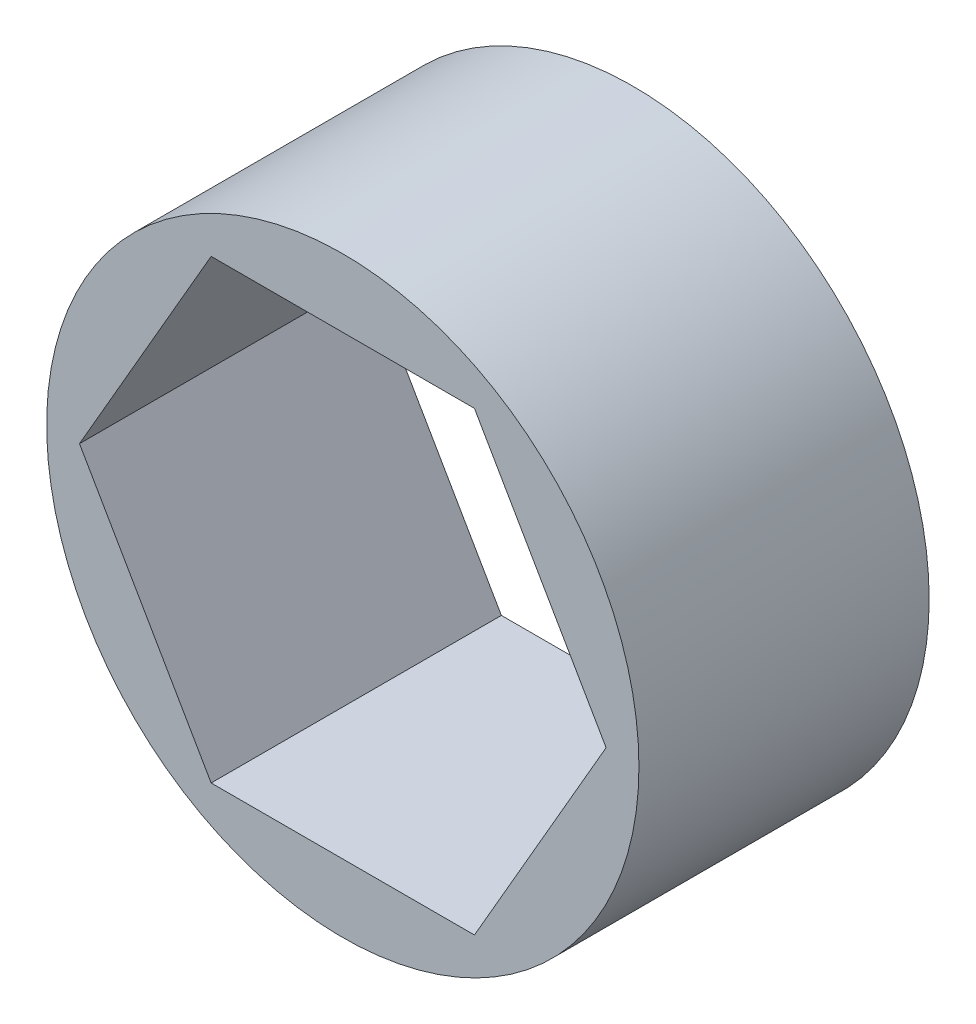
ISO-10303-21;
HEADER;
FILE_DESCRIPTION(('STEP AP214'),'2;1');
FILE_NAME('part.step','',(''),(''),'','','');
FILE_SCHEMA(('AUTOMOTIVE_DESIGN { 1 0 10303 214 1 1 1 1 }'));
ENDSEC;
DATA;
#1=APPLICATION_CONTEXT('core data for automotive mechanical design processes');
#2=APPLICATION_PROTOCOL_DEFINITION('international standard','automotive_design',2000,#1);
#3=PRODUCT_CONTEXT('',#1,'mechanical');
#4=PRODUCT('Part','Part','',(#3));
#5=PRODUCT_RELATED_PRODUCT_CATEGORY('part','',(#4));
#6=PRODUCT_DEFINITION_FORMATION('','',#4);
#7=PRODUCT_DEFINITION_CONTEXT('part definition',#1,'design');
#8=PRODUCT_DEFINITION('design','',#6,#7);
#9=PRODUCT_DEFINITION_SHAPE('','',#8);
#10=(LENGTH_UNIT() NAMED_UNIT(*) SI_UNIT(.MILLI.,.METRE.));
#11=(NAMED_UNIT(*) PLANE_ANGLE_UNIT() SI_UNIT($,.RADIAN.));
#12=(NAMED_UNIT(*) SI_UNIT($,.STERADIAN.) SOLID_ANGLE_UNIT());
#13=UNCERTAINTY_MEASURE_WITH_UNIT(LENGTH_MEASURE(1.E-05),#10,'distance_accuracy_value','');
#14=(GEOMETRIC_REPRESENTATION_CONTEXT(3) GLOBAL_UNCERTAINTY_ASSIGNED_CONTEXT((#13)) GLOBAL_UNIT_ASSIGNED_CONTEXT((#10,
#11,#12)) REPRESENTATION_CONTEXT('',''));
#15=CARTESIAN_POINT('',(0.,0.,0.));
#16=DIRECTION('',(0.,0.,1.));
#17=DIRECTION('',(1.,0.,0.));
#18=AXIS2_PLACEMENT_3D('',#15,#16,#17);
#19=CARTESIAN_POINT('',(0.,0.,6.223));
#20=DIRECTION('',(0.,0.,1.));
#21=DIRECTION('',(1.,0.,0.));
#22=AXIS2_PLACEMENT_3D('',#19,#20,#21);
#23=PLANE('',#22);
#24=CARTESIAN_POINT('',(0.,0.,6.223));
#25=DIRECTION('',(0.,0.,1.));
#26=DIRECTION('',(1.,0.,0.));
#27=AXIS2_PLACEMENT_3D('',#24,#25,#26);
#28=CIRCLE('',#27,6.35);
#29=CARTESIAN_POINT('',(6.35,0.,6.223));
#30=VERTEX_POINT('',#29);
#31=EDGE_CURVE('E11',#30,#30,#28,.T.);
#32=ORIENTED_EDGE('',*,*,#31,.T.);
#33=EDGE_LOOP('',(#32));
#34=FACE_BOUND('',#33,.T.);
#35=DIRECTION('',(-0.500000000000001,0.866025403784438,0.));
#36=VECTOR('',#35,1.);
#37=CARTESIAN_POINT('',(5.64590828240532,0.,6.223));
#38=LINE('',#37,#36);
#39=CARTESIAN_POINT('',(5.64590828240532,0.,6.223));
#40=VERTEX_POINT('',#39);
#41=CARTESIAN_POINT('',(2.82295414120265,4.88949999999998,6.223));
#42=VERTEX_POINT('',#41);
#43=EDGE_CURVE('E102',#40,#42,#38,.T.);
#44=ORIENTED_EDGE('',*,*,#43,.F.);
#45=DIRECTION('',(0.499999999999995,0.866025403784442,0.));
#46=VECTOR('',#45,1.);
#47=CARTESIAN_POINT('',(2.82295414120272,-4.88949999999994,6.223));
#48=LINE('',#47,#46);
#49=CARTESIAN_POINT('',(2.82295414120272,-4.88949999999994,6.223));
#50=VERTEX_POINT('',#49);
#51=EDGE_CURVE('E94',#50,#40,#48,.T.);
#52=ORIENTED_EDGE('',*,*,#51,.F.);
#53=DIRECTION('',(1.,0.,0.));
#54=VECTOR('',#53,1.);
#55=CARTESIAN_POINT('',(-2.82295414120262,-4.8895,6.223));
#56=LINE('',#55,#54);
#57=CARTESIAN_POINT('',(-2.82295414120262,-4.8895,6.223));
#58=VERTEX_POINT('',#57);
#59=EDGE_CURVE('E122',#58,#50,#56,.T.);
#60=ORIENTED_EDGE('',*,*,#59,.F.);
#61=DIRECTION('',(0.500000000000007,-0.866025403784435,0.));
#62=VECTOR('',#61,1.);
#63=CARTESIAN_POINT('',(-5.64590828240532,0.,6.223));
#64=LINE('',#63,#62);
#65=CARTESIAN_POINT('',(-5.64590828240532,0.,6.223));
#66=VERTEX_POINT('',#65);
#67=EDGE_CURVE('E120',#66,#58,#64,.T.);
#68=ORIENTED_EDGE('',*,*,#67,.F.);
#69=DIRECTION('',(-0.499999999999995,-0.866025403784442,0.));
#70=VECTOR('',#69,1.);
#71=CARTESIAN_POINT('',(-2.82295414120268,4.88949999999996,6.223));
#72=LINE('',#71,#70);
#73=CARTESIAN_POINT('',(-2.82295414120268,4.88949999999996,6.223));
#74=VERTEX_POINT('',#73);
#75=EDGE_CURVE('E116',#74,#66,#72,.T.);
#76=ORIENTED_EDGE('',*,*,#75,.F.);
#77=DIRECTION('',(-1.,0.,0.));
#78=VECTOR('',#77,1.);
#79=CARTESIAN_POINT('',(2.82295414120265,4.88949999999998,6.223));
#80=LINE('',#79,#78);
#81=EDGE_CURVE('E114',#42,#74,#80,.T.);
#82=ORIENTED_EDGE('',*,*,#81,.F.);
#83=EDGE_LOOP('',(#44,#52,#60,#68,#76,#82));
#84=FACE_BOUND('',#83,.T.);
#85=ADVANCED_FACE('F41',(#34,#84),#23,.T.);
#86=CARTESIAN_POINT('',(0.,0.,0.));
#87=DIRECTION('',(0.,0.,1.));
#88=DIRECTION('',(1.,0.,0.));
#89=AXIS2_PLACEMENT_3D('',#86,#87,#88);
#90=PLANE('',#89);
#91=CARTESIAN_POINT('',(0.,0.,0.));
#92=DIRECTION('',(0.,0.,1.));
#93=DIRECTION('',(1.,0.,0.));
#94=AXIS2_PLACEMENT_3D('',#91,#92,#93);
#95=CIRCLE('',#94,6.35);
#96=CARTESIAN_POINT('',(6.35,0.,0.));
#97=VERTEX_POINT('',#96);
#98=EDGE_CURVE('E45',#97,#97,#95,.T.);
#99=ORIENTED_EDGE('',*,*,#98,.F.);
#100=EDGE_LOOP('',(#99));
#101=FACE_BOUND('',#100,.T.);
#102=DIRECTION('',(0.499999999999995,0.866025403784442,0.));
#103=VECTOR('',#102,1.);
#104=CARTESIAN_POINT('',(2.82295414120272,-4.88949999999994,0.));
#105=LINE('',#104,#103);
#106=CARTESIAN_POINT('',(2.82295414120272,-4.88949999999994,0.));
#107=VERTEX_POINT('',#106);
#108=CARTESIAN_POINT('',(5.64590828240532,0.,0.));
#109=VERTEX_POINT('',#108);
#110=EDGE_CURVE('E64',#107,#109,#105,.T.);
#111=ORIENTED_EDGE('',*,*,#110,.T.);
#112=DIRECTION('',(-0.500000000000001,0.866025403784438,0.));
#113=VECTOR('',#112,1.);
#114=CARTESIAN_POINT('',(5.64590828240532,0.,0.));
#115=LINE('',#114,#113);
#116=CARTESIAN_POINT('',(2.82295414120265,4.88949999999998,0.));
#117=VERTEX_POINT('',#116);
#118=EDGE_CURVE('E109',#109,#117,#115,.T.);
#119=ORIENTED_EDGE('',*,*,#118,.T.);
#120=DIRECTION('',(-1.,0.,0.));
#121=VECTOR('',#120,1.);
#122=CARTESIAN_POINT('',(2.82295414120265,4.88949999999998,0.));
#123=LINE('',#122,#121);
#124=CARTESIAN_POINT('',(-2.82295414120268,4.88949999999996,0.));
#125=VERTEX_POINT('',#124);
#126=EDGE_CURVE('E126',#117,#125,#123,.T.);
#127=ORIENTED_EDGE('',*,*,#126,.T.);
#128=DIRECTION('',(-0.499999999999995,-0.866025403784442,0.));
#129=VECTOR('',#128,1.);
#130=CARTESIAN_POINT('',(-2.82295414120268,4.88949999999996,0.));
#131=LINE('',#130,#129);
#132=CARTESIAN_POINT('',(-5.64590828240532,0.,0.));
#133=VERTEX_POINT('',#132);
#134=EDGE_CURVE('E129',#125,#133,#131,.T.);
#135=ORIENTED_EDGE('',*,*,#134,.T.);
#136=DIRECTION('',(0.500000000000007,-0.866025403784435,0.));
#137=VECTOR('',#136,1.);
#138=CARTESIAN_POINT('',(-5.64590828240532,0.,0.));
#139=LINE('',#138,#137);
#140=CARTESIAN_POINT('',(-2.82295414120262,-4.8895,0.));
#141=VERTEX_POINT('',#140);
#142=EDGE_CURVE('E132',#133,#141,#139,.T.);
#143=ORIENTED_EDGE('',*,*,#142,.T.);
#144=DIRECTION('',(1.,0.,0.));
#145=VECTOR('',#144,1.);
#146=CARTESIAN_POINT('',(-2.82295414120262,-4.8895,0.));
#147=LINE('',#146,#145);
#148=EDGE_CURVE('E103',#141,#107,#147,.T.);
#149=ORIENTED_EDGE('',*,*,#148,.T.);
#150=EDGE_LOOP('',(#111,#119,#127,#135,#143,#149));
#151=FACE_BOUND('',#150,.T.);
#152=ADVANCED_FACE('F149',(#101,#151),#90,.F.);
#153=CARTESIAN_POINT('',(0.,0.,6.223));
#154=DIRECTION('',(0.,0.,-1.));
#155=DIRECTION('',(-1.,0.,0.));
#156=AXIS2_PLACEMENT_3D('',#153,#154,#155);
#157=CYLINDRICAL_SURFACE('',#156,6.35);
#158=ORIENTED_EDGE('',*,*,#31,.F.);
#159=EDGE_LOOP('',(#158));
#160=FACE_BOUND('',#159,.T.);
#161=ORIENTED_EDGE('',*,*,#98,.T.);
#162=EDGE_LOOP('',(#161));
#163=FACE_BOUND('',#162,.T.);
#164=ADVANCED_FACE('F43',(#160,#163),#157,.T.);
#165=CARTESIAN_POINT('',(2.82295414120272,-4.88949999999994,6.223));
#166=DIRECTION('',(-0.866025403784441,0.499999999999995,0.));
#167=DIRECTION('',(-0.499999999999995,-0.866025403784442,0.));
#168=AXIS2_PLACEMENT_3D('',#165,#166,#167);
#169=PLANE('',#168);
#170=ORIENTED_EDGE('',*,*,#110,.F.);
#171=DIRECTION('',(0.,0.,-1.));
#172=VECTOR('',#171,1.);
#173=CARTESIAN_POINT('',(2.82295414120272,-4.88949999999994,6.223));
#174=LINE('',#173,#172);
#175=EDGE_CURVE('E98',#50,#107,#174,.T.);
#176=ORIENTED_EDGE('',*,*,#175,.F.);
#177=ORIENTED_EDGE('',*,*,#51,.T.);
#178=DIRECTION('',(0.,0.,-1.));
#179=VECTOR('',#178,1.);
#180=CARTESIAN_POINT('',(5.64590828240532,0.,6.223));
#181=LINE('',#180,#179);
#182=EDGE_CURVE('E97',#40,#109,#181,.T.);
#183=ORIENTED_EDGE('',*,*,#182,.T.);
#184=EDGE_LOOP('',(#170,#176,#177,#183));
#185=FACE_BOUND('',#184,.T.);
#186=ADVANCED_FACE('F96',(#185),#169,.T.);
#187=CARTESIAN_POINT('',(5.64590828240532,0.,6.223));
#188=DIRECTION('',(-0.866025403784438,-0.500000000000001,0.));
#189=DIRECTION('',(0.500000000000001,-0.866025403784438,0.));
#190=AXIS2_PLACEMENT_3D('',#187,#188,#189);
#191=PLANE('',#190);
#192=ORIENTED_EDGE('',*,*,#118,.F.);
#193=ORIENTED_EDGE('',*,*,#182,.F.);
#194=ORIENTED_EDGE('',*,*,#43,.T.);
#195=DIRECTION('',(0.,0.,-1.));
#196=VECTOR('',#195,1.);
#197=CARTESIAN_POINT('',(2.82295414120265,4.88949999999998,6.223));
#198=LINE('',#197,#196);
#199=EDGE_CURVE('E110',#42,#117,#198,.T.);
#200=ORIENTED_EDGE('',*,*,#199,.T.);
#201=EDGE_LOOP('',(#192,#193,#194,#200));
#202=FACE_BOUND('',#201,.T.);
#203=ADVANCED_FACE('F106',(#202),#191,.T.);
#204=CARTESIAN_POINT('',(2.82295414120265,4.88949999999998,6.223));
#205=DIRECTION('',(0.,-1.,0.));
#206=DIRECTION('',(1.,0.,0.));
#207=AXIS2_PLACEMENT_3D('',#204,#205,#206);
#208=PLANE('',#207);
#209=ORIENTED_EDGE('',*,*,#126,.F.);
#210=ORIENTED_EDGE('',*,*,#199,.F.);
#211=ORIENTED_EDGE('',*,*,#81,.T.);
#212=DIRECTION('',(0.,0.,-1.));
#213=VECTOR('',#212,1.);
#214=CARTESIAN_POINT('',(-2.82295414120268,4.88949999999996,6.223));
#215=LINE('',#214,#213);
#216=EDGE_CURVE('E141',#74,#125,#215,.T.);
#217=ORIENTED_EDGE('',*,*,#216,.T.);
#218=EDGE_LOOP('',(#209,#210,#211,#217));
#219=FACE_BOUND('',#218,.T.);
#220=ADVANCED_FACE('F145',(#219),#208,.T.);
#221=CARTESIAN_POINT('',(-2.82295414120268,4.88949999999996,6.223));
#222=DIRECTION('',(0.866025403784442,-0.499999999999995,0.));
#223=DIRECTION('',(0.499999999999995,0.866025403784442,0.));
#224=AXIS2_PLACEMENT_3D('',#221,#222,#223);
#225=PLANE('',#224);
#226=ORIENTED_EDGE('',*,*,#134,.F.);
#227=ORIENTED_EDGE('',*,*,#216,.F.);
#228=ORIENTED_EDGE('',*,*,#75,.T.);
#229=DIRECTION('',(0.,0.,-1.));
#230=VECTOR('',#229,1.);
#231=CARTESIAN_POINT('',(-5.64590828240532,0.,6.223));
#232=LINE('',#231,#230);
#233=EDGE_CURVE('E139',#66,#133,#232,.T.);
#234=ORIENTED_EDGE('',*,*,#233,.T.);
#235=EDGE_LOOP('',(#226,#227,#228,#234));
#236=FACE_BOUND('',#235,.T.);
#237=ADVANCED_FACE('F157',(#236),#225,.T.);
#238=CARTESIAN_POINT('',(-5.64590828240532,0.,6.223));
#239=DIRECTION('',(0.866025403784435,0.500000000000007,0.));
#240=DIRECTION('',(-0.500000000000007,0.866025403784435,0.));
#241=AXIS2_PLACEMENT_3D('',#238,#239,#240);
#242=PLANE('',#241);
#243=ORIENTED_EDGE('',*,*,#142,.F.);
#244=ORIENTED_EDGE('',*,*,#233,.F.);
#245=ORIENTED_EDGE('',*,*,#67,.T.);
#246=DIRECTION('',(0.,0.,-1.));
#247=VECTOR('',#246,1.);
#248=CARTESIAN_POINT('',(-2.82295414120262,-4.8895,6.223));
#249=LINE('',#248,#247);
#250=EDGE_CURVE('E56',#58,#141,#249,.T.);
#251=ORIENTED_EDGE('',*,*,#250,.T.);
#252=EDGE_LOOP('',(#243,#244,#245,#251));
#253=FACE_BOUND('',#252,.T.);
#254=ADVANCED_FACE('F155',(#253),#242,.T.);
#255=CARTESIAN_POINT('',(-2.82295414120262,-4.8895,6.223));
#256=DIRECTION('',(0.,1.,0.));
#257=DIRECTION('',(-1.,0.,0.));
#258=AXIS2_PLACEMENT_3D('',#255,#256,#257);
#259=PLANE('',#258);
#260=ORIENTED_EDGE('',*,*,#148,.F.);
#261=ORIENTED_EDGE('',*,*,#250,.F.);
#262=ORIENTED_EDGE('',*,*,#59,.T.);
#263=ORIENTED_EDGE('',*,*,#175,.T.);
#264=EDGE_LOOP('',(#260,#261,#262,#263));
#265=FACE_BOUND('',#264,.T.);
#266=ADVANCED_FACE('F151',(#265),#259,.T.);
#267=CLOSED_SHELL('',(#85,#152,#164,#186,#203,#220,#237,#254,#266));
#268=MANIFOLD_SOLID_BREP('B2',#267);
#269=ADVANCED_BREP_SHAPE_REPRESENTATION('',(#18,#268),#14);
#270=SHAPE_DEFINITION_REPRESENTATION(#9,#269);
ENDSEC;
END-ISO-10303-21;
